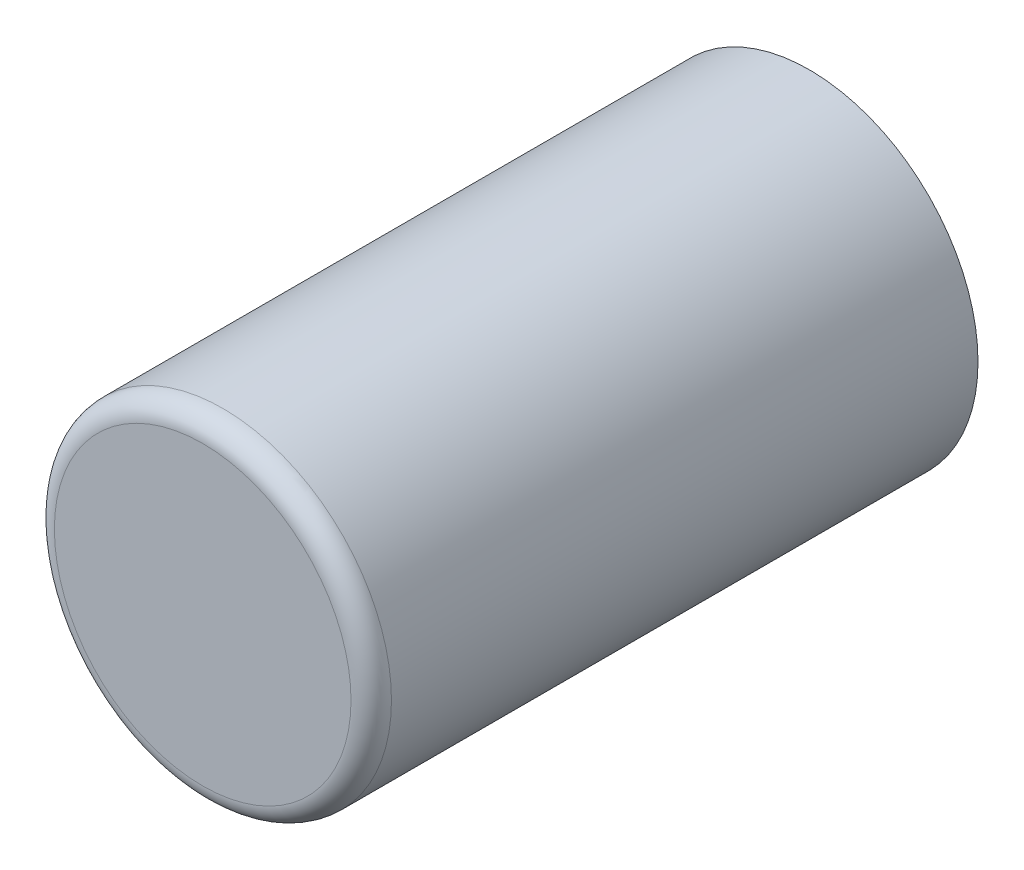
ISO-10303-21;
HEADER;
FILE_DESCRIPTION(('STEP AP214'),'2;1');
FILE_NAME('part.step','',(''),(''),'','','');
FILE_SCHEMA(('AUTOMOTIVE_DESIGN { 1 0 10303 214 1 1 1 1 }'));
ENDSEC;
DATA;
#1=APPLICATION_CONTEXT('core data for automotive mechanical design processes');
#2=APPLICATION_PROTOCOL_DEFINITION('international standard','automotive_design',2000,#1);
#3=PRODUCT_CONTEXT('',#1,'mechanical');
#4=PRODUCT('Part','Part','',(#3));
#5=PRODUCT_RELATED_PRODUCT_CATEGORY('part','',(#4));
#6=PRODUCT_DEFINITION_FORMATION('','',#4);
#7=PRODUCT_DEFINITION_CONTEXT('part definition',#1,'design');
#8=PRODUCT_DEFINITION('design','',#6,#7);
#9=PRODUCT_DEFINITION_SHAPE('','',#8);
#10=(LENGTH_UNIT() NAMED_UNIT(*) SI_UNIT(.MILLI.,.METRE.));
#11=(NAMED_UNIT(*) PLANE_ANGLE_UNIT() SI_UNIT($,.RADIAN.));
#12=(NAMED_UNIT(*) SI_UNIT($,.STERADIAN.) SOLID_ANGLE_UNIT());
#13=UNCERTAINTY_MEASURE_WITH_UNIT(LENGTH_MEASURE(1.E-05),#10,'distance_accuracy_value','');
#14=(GEOMETRIC_REPRESENTATION_CONTEXT(3) GLOBAL_UNCERTAINTY_ASSIGNED_CONTEXT((#13)) GLOBAL_UNIT_ASSIGNED_CONTEXT((#10,
#11,#12)) REPRESENTATION_CONTEXT('',''));
#15=CARTESIAN_POINT('',(0.,0.,0.));
#16=DIRECTION('',(0.,0.,1.));
#17=DIRECTION('',(1.,0.,0.));
#18=AXIS2_PLACEMENT_3D('',#15,#16,#17);
#19=CARTESIAN_POINT('',(0.,0.,9.));
#20=DIRECTION('',(0.,0.,-1.));
#21=DIRECTION('',(-1.,0.,0.));
#22=AXIS2_PLACEMENT_3D('',#19,#20,#21);
#23=CYLINDRICAL_SURFACE('',#22,2.5);
#24=CARTESIAN_POINT('',(0.,0.,8.7));
#25=DIRECTION('',(0.,0.,1.));
#26=DIRECTION('',(1.,0.,0.));
#27=AXIS2_PLACEMENT_3D('',#24,#25,#26);
#28=CIRCLE('',#27,2.5);
#29=CARTESIAN_POINT('',(2.5,0.,8.7));
#30=VERTEX_POINT('',#29);
#31=EDGE_CURVE('E11',#30,#30,#28,.F.);
#32=ORIENTED_EDGE('',*,*,#31,.T.);
#33=EDGE_LOOP('',(#32));
#34=FACE_BOUND('',#33,.T.);
#35=CARTESIAN_POINT('',(0.,0.,0.));
#36=DIRECTION('',(0.,0.,1.));
#37=DIRECTION('',(1.,0.,0.));
#38=AXIS2_PLACEMENT_3D('',#35,#36,#37);
#39=CIRCLE('',#38,2.5);
#40=CARTESIAN_POINT('',(2.5,0.,0.));
#41=VERTEX_POINT('',#40);
#42=EDGE_CURVE('E114',#41,#41,#39,.T.);
#43=ORIENTED_EDGE('',*,*,#42,.T.);
#44=EDGE_LOOP('',(#43));
#45=FACE_BOUND('',#44,.T.);
#46=ADVANCED_FACE('F38',(#34,#45),#23,.T.);
#47=CARTESIAN_POINT('',(0.,0.,9.));
#48=DIRECTION('',(0.,0.,1.));
#49=DIRECTION('',(1.,0.,0.));
#50=AXIS2_PLACEMENT_3D('',#47,#48,#49);
#51=PLANE('',#50);
#52=CARTESIAN_POINT('',(0.,0.,9.));
#53=DIRECTION('',(0.,0.,1.));
#54=DIRECTION('',(1.,0.,0.));
#55=AXIS2_PLACEMENT_3D('',#52,#53,#54);
#56=CIRCLE('',#55,2.2);
#57=CARTESIAN_POINT('',(2.2,0.,9.));
#58=VERTEX_POINT('',#57);
#59=EDGE_CURVE('E46',#58,#58,#56,.T.);
#60=ORIENTED_EDGE('',*,*,#59,.T.);
#61=EDGE_LOOP('',(#60));
#62=FACE_BOUND('',#61,.T.);
#63=ADVANCED_FACE('F121',(#62),#51,.T.);
#64=CARTESIAN_POINT('',(0.,0.,0.));
#65=DIRECTION('',(0.,0.,1.));
#66=DIRECTION('',(1.,0.,0.));
#67=AXIS2_PLACEMENT_3D('',#64,#65,#66);
#68=PLANE('',#67);
#69=DIRECTION('',(1.,0.,0.));
#70=VECTOR('',#69,1.);
#71=CARTESIAN_POINT('',(1.5,1.5,0.));
#72=LINE('',#71,#70);
#73=CARTESIAN_POINT('',(-1.5,1.5,0.));
#74=VERTEX_POINT('',#73);
#75=CARTESIAN_POINT('',(1.5,1.5,0.));
#76=VERTEX_POINT('',#75);
#77=EDGE_CURVE('E88',#74,#76,#72,.T.);
#78=ORIENTED_EDGE('',*,*,#77,.F.);
#79=DIRECTION('',(0.,1.,0.));
#80=VECTOR('',#79,1.);
#81=CARTESIAN_POINT('',(-1.5,-1.5,0.));
#82=LINE('',#81,#80);
#83=CARTESIAN_POINT('',(-1.5,-1.5,0.));
#84=VERTEX_POINT('',#83);
#85=EDGE_CURVE('E53',#84,#74,#82,.T.);
#86=ORIENTED_EDGE('',*,*,#85,.F.);
#87=DIRECTION('',(-1.,0.,0.));
#88=VECTOR('',#87,1.);
#89=CARTESIAN_POINT('',(1.5,-1.5,0.));
#90=LINE('',#89,#88);
#91=CARTESIAN_POINT('',(1.5,-1.5,0.));
#92=VERTEX_POINT('',#91);
#93=EDGE_CURVE('E104',#92,#84,#90,.T.);
#94=ORIENTED_EDGE('',*,*,#93,.F.);
#95=DIRECTION('',(0.,-1.,0.));
#96=VECTOR('',#95,1.);
#97=CARTESIAN_POINT('',(1.5,-1.5,0.));
#98=LINE('',#97,#96);
#99=EDGE_CURVE('E110',#76,#92,#98,.T.);
#100=ORIENTED_EDGE('',*,*,#99,.F.);
#101=EDGE_LOOP('',(#78,#86,#94,#100));
#102=FACE_BOUND('',#101,.T.);
#103=ORIENTED_EDGE('',*,*,#42,.F.);
#104=EDGE_LOOP('',(#103));
#105=FACE_BOUND('',#104,.T.);
#106=ADVANCED_FACE('F125',(#102,#105),#68,.F.);
#107=CARTESIAN_POINT('',(0.,0.,8.7));
#108=DIRECTION('',(0.,0.,1.));
#109=DIRECTION('',(1.,0.,0.));
#110=AXIS2_PLACEMENT_3D('',#107,#108,#109);
#111=TOROIDAL_SURFACE('',#110,2.2,0.3);
#112=ORIENTED_EDGE('',*,*,#31,.F.);
#113=EDGE_LOOP('',(#112));
#114=FACE_BOUND('',#113,.T.);
#115=ORIENTED_EDGE('',*,*,#59,.F.);
#116=EDGE_LOOP('',(#115));
#117=FACE_BOUND('',#116,.T.);
#118=ADVANCED_FACE('F40',(#114,#117),#111,.T.);
#119=CARTESIAN_POINT('',(-1.5,-1.5,4.));
#120=DIRECTION('',(-1.,0.,0.));
#121=DIRECTION('',(0.,0.,1.));
#122=AXIS2_PLACEMENT_3D('',#119,#120,#121);
#123=PLANE('',#122);
#124=ORIENTED_EDGE('',*,*,#85,.T.);
#125=DIRECTION('',(0.,0.,-1.));
#126=VECTOR('',#125,1.);
#127=CARTESIAN_POINT('',(-1.5,1.5,4.));
#128=LINE('',#127,#126);
#129=CARTESIAN_POINT('',(-1.5,1.5,4.));
#130=VERTEX_POINT('',#129);
#131=EDGE_CURVE('E76',#130,#74,#128,.T.);
#132=ORIENTED_EDGE('',*,*,#131,.F.);
#133=DIRECTION('',(0.,1.,0.));
#134=VECTOR('',#133,1.);
#135=CARTESIAN_POINT('',(-1.5,-1.5,4.));
#136=LINE('',#135,#134);
#137=CARTESIAN_POINT('',(-1.5,-1.5,4.));
#138=VERTEX_POINT('',#137);
#139=EDGE_CURVE('E102',#138,#130,#136,.T.);
#140=ORIENTED_EDGE('',*,*,#139,.F.);
#141=DIRECTION('',(0.,0.,-1.));
#142=VECTOR('',#141,1.);
#143=CARTESIAN_POINT('',(-1.5,-1.5,4.));
#144=LINE('',#143,#142);
#145=EDGE_CURVE('E61',#138,#84,#144,.T.);
#146=ORIENTED_EDGE('',*,*,#145,.T.);
#147=EDGE_LOOP('',(#124,#132,#140,#146));
#148=FACE_BOUND('',#147,.T.);
#149=ADVANCED_FACE('F124',(#148),#123,.F.);
#150=CARTESIAN_POINT('',(1.5,-1.5,4.));
#151=DIRECTION('',(0.,-1.,0.));
#152=DIRECTION('',(0.,0.,-1.));
#153=AXIS2_PLACEMENT_3D('',#150,#151,#152);
#154=PLANE('',#153);
#155=ORIENTED_EDGE('',*,*,#93,.T.);
#156=ORIENTED_EDGE('',*,*,#145,.F.);
#157=DIRECTION('',(-1.,0.,0.));
#158=VECTOR('',#157,1.);
#159=CARTESIAN_POINT('',(1.5,-1.5,4.));
#160=LINE('',#159,#158);
#161=CARTESIAN_POINT('',(1.5,-1.5,4.));
#162=VERTEX_POINT('',#161);
#163=EDGE_CURVE('E99',#162,#138,#160,.T.);
#164=ORIENTED_EDGE('',*,*,#163,.F.);
#165=DIRECTION('',(0.,0.,-1.));
#166=VECTOR('',#165,1.);
#167=CARTESIAN_POINT('',(1.5,-1.5,4.));
#168=LINE('',#167,#166);
#169=EDGE_CURVE('E92',#162,#92,#168,.T.);
#170=ORIENTED_EDGE('',*,*,#169,.T.);
#171=EDGE_LOOP('',(#155,#156,#164,#170));
#172=FACE_BOUND('',#171,.T.);
#173=ADVANCED_FACE('F131',(#172),#154,.F.);
#174=CARTESIAN_POINT('',(1.5,-1.5,4.));
#175=DIRECTION('',(1.,0.,0.));
#176=DIRECTION('',(0.,0.,-1.));
#177=AXIS2_PLACEMENT_3D('',#174,#175,#176);
#178=PLANE('',#177);
#179=ORIENTED_EDGE('',*,*,#99,.T.);
#180=ORIENTED_EDGE('',*,*,#169,.F.);
#181=DIRECTION('',(0.,-1.,0.));
#182=VECTOR('',#181,1.);
#183=CARTESIAN_POINT('',(1.5,-1.5,4.));
#184=LINE('',#183,#182);
#185=CARTESIAN_POINT('',(1.5,1.5,4.));
#186=VERTEX_POINT('',#185);
#187=EDGE_CURVE('E95',#186,#162,#184,.T.);
#188=ORIENTED_EDGE('',*,*,#187,.F.);
#189=DIRECTION('',(0.,0.,-1.));
#190=VECTOR('',#189,1.);
#191=CARTESIAN_POINT('',(1.5,1.5,4.));
#192=LINE('',#191,#190);
#193=EDGE_CURVE('E81',#186,#76,#192,.T.);
#194=ORIENTED_EDGE('',*,*,#193,.T.);
#195=EDGE_LOOP('',(#179,#180,#188,#194));
#196=FACE_BOUND('',#195,.T.);
#197=ADVANCED_FACE('F96',(#196),#178,.F.);
#198=CARTESIAN_POINT('',(1.5,1.5,4.));
#199=DIRECTION('',(0.,1.,0.));
#200=DIRECTION('',(0.,0.,1.));
#201=AXIS2_PLACEMENT_3D('',#198,#199,#200);
#202=PLANE('',#201);
#203=ORIENTED_EDGE('',*,*,#77,.T.);
#204=ORIENTED_EDGE('',*,*,#193,.F.);
#205=DIRECTION('',(1.,0.,0.));
#206=VECTOR('',#205,1.);
#207=CARTESIAN_POINT('',(1.5,1.5,4.));
#208=LINE('',#207,#206);
#209=EDGE_CURVE('E85',#130,#186,#208,.T.);
#210=ORIENTED_EDGE('',*,*,#209,.F.);
#211=ORIENTED_EDGE('',*,*,#131,.T.);
#212=EDGE_LOOP('',(#203,#204,#210,#211));
#213=FACE_BOUND('',#212,.T.);
#214=ADVANCED_FACE('F83',(#213),#202,.F.);
#215=CARTESIAN_POINT('',(0.,0.,4.));
#216=DIRECTION('',(0.,0.,1.));
#217=DIRECTION('',(1.,0.,0.));
#218=AXIS2_PLACEMENT_3D('',#215,#216,#217);
#219=PLANE('',#218);
#220=ORIENTED_EDGE('',*,*,#139,.T.);
#221=ORIENTED_EDGE('',*,*,#209,.T.);
#222=ORIENTED_EDGE('',*,*,#187,.T.);
#223=ORIENTED_EDGE('',*,*,#163,.T.);
#224=EDGE_LOOP('',(#220,#221,#222,#223));
#225=FACE_BOUND('',#224,.T.);
#226=ADVANCED_FACE('F101',(#225),#219,.F.);
#227=CLOSED_SHELL('',(#46,#63,#106,#118,#149,#173,#197,#214,#226));
#228=MANIFOLD_SOLID_BREP('B2',#227);
#229=ADVANCED_BREP_SHAPE_REPRESENTATION('',(#18,#228),#14);
#230=SHAPE_DEFINITION_REPRESENTATION(#9,#229);
ENDSEC;
END-ISO-10303-21;
